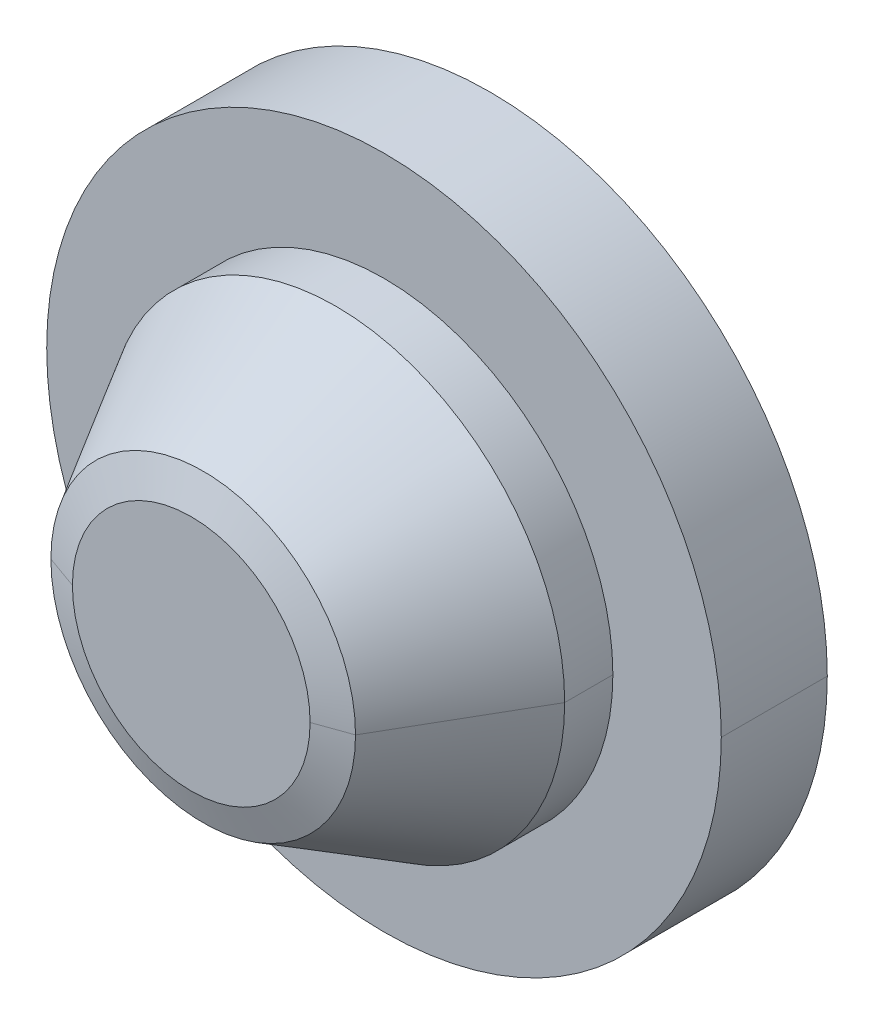
ISO-10303-21;
HEADER;
FILE_DESCRIPTION(('STEP AP214'),'2;1');
FILE_NAME('part.step','',(''),(''),'','','');
FILE_SCHEMA(('AUTOMOTIVE_DESIGN { 1 0 10303 214 1 1 1 1 }'));
ENDSEC;
DATA;
#1=APPLICATION_CONTEXT('core data for automotive mechanical design processes');
#2=APPLICATION_PROTOCOL_DEFINITION('international standard','automotive_design',2000,#1);
#3=PRODUCT_CONTEXT('',#1,'mechanical');
#4=PRODUCT('Part','Part','',(#3));
#5=PRODUCT_RELATED_PRODUCT_CATEGORY('part','',(#4));
#6=PRODUCT_DEFINITION_FORMATION('','',#4);
#7=PRODUCT_DEFINITION_CONTEXT('part definition',#1,'design');
#8=PRODUCT_DEFINITION('design','',#6,#7);
#9=PRODUCT_DEFINITION_SHAPE('','',#8);
#10=(LENGTH_UNIT() NAMED_UNIT(*) SI_UNIT(.MILLI.,.METRE.));
#11=(NAMED_UNIT(*) PLANE_ANGLE_UNIT() SI_UNIT($,.RADIAN.));
#12=(NAMED_UNIT(*) SI_UNIT($,.STERADIAN.) SOLID_ANGLE_UNIT());
#13=UNCERTAINTY_MEASURE_WITH_UNIT(LENGTH_MEASURE(1.E-05),#10,'distance_accuracy_value','');
#14=(GEOMETRIC_REPRESENTATION_CONTEXT(3) GLOBAL_UNCERTAINTY_ASSIGNED_CONTEXT((#13)) GLOBAL_UNIT_ASSIGNED_CONTEXT((#10,
#11,#12)) REPRESENTATION_CONTEXT('',''));
#15=CARTESIAN_POINT('',(0.,0.,0.));
#16=DIRECTION('',(0.,0.,1.));
#17=DIRECTION('',(1.,0.,0.));
#18=AXIS2_PLACEMENT_3D('',#15,#16,#17);
#19=CARTESIAN_POINT('',(149.998561493102,150.001438506898,-74.85));
#20=DIRECTION('',(0.,0.,1.));
#21=DIRECTION('',(1.,0.,0.));
#22=AXIS2_PLACEMENT_3D('',#19,#20,#21);
#23=PLANE('',#22);
#24=CARTESIAN_POINT('',(149.998561493102,150.001438506898,-74.85));
#25=DIRECTION('',(0.,0.,1.));
#26=DIRECTION('',(-1.,0.,0.));
#27=AXIS2_PLACEMENT_3D('',#24,#25,#26);
#28=CIRCLE('',#27,24.66356025634);
#29=CARTESIAN_POINT('',(125.335001236762,150.001438506898,-74.85));
#30=VERTEX_POINT('',#29);
#31=CARTESIAN_POINT('',(174.662121749443,150.001438506898,-74.85));
#32=VERTEX_POINT('',#31);
#33=EDGE_CURVE('E11',#30,#32,#28,.T.);
#34=ORIENTED_EDGE('',*,*,#33,.T.);
#35=CARTESIAN_POINT('',(149.998561493102,150.001438506898,-74.85));
#36=DIRECTION('',(0.,0.,-1.));
#37=DIRECTION('',(-1.,0.,0.));
#38=AXIS2_PLACEMENT_3D('',#35,#36,#37);
#39=CIRCLE('',#38,24.66356025634);
#40=EDGE_CURVE('E28',#30,#32,#39,.T.);
#41=ORIENTED_EDGE('',*,*,#40,.F.);
#42=EDGE_LOOP('',(#34,#41));
#43=FACE_BOUND('',#42,.T.);
#44=ADVANCED_FACE('F17',(#43),#23,.T.);
#45=CARTESIAN_POINT('',(149.998561493102,150.001438506898,-76.09));
#46=DIRECTION('',(0.,0.,-1.));
#47=DIRECTION('',(-1.,0.,0.));
#48=AXIS2_PLACEMENT_3D('',#45,#46,#47);
#49=CONICAL_SURFACE('',#48,28.13744042412,1.22794382715052);
#50=ORIENTED_EDGE('',*,*,#40,.T.);
#51=DIRECTION('',(0.941799559527832,0.,-0.336174939091512));
#52=VECTOR('',#51,1.);
#53=CARTESIAN_POINT('',(174.662121749443,150.001438506898,-74.85));
#54=LINE('',#53,#52);
#55=CARTESIAN_POINT('',(181.609882085003,150.001438506898,-77.33));
#56=VERTEX_POINT('',#55);
#57=EDGE_CURVE('E75',#32,#56,#54,.T.);
#58=ORIENTED_EDGE('',*,*,#57,.T.);
#59=CARTESIAN_POINT('',(149.998561493102,150.001438506898,-77.33));
#60=DIRECTION('',(0.,0.,-1.));
#61=DIRECTION('',(-1.,0.,0.));
#62=AXIS2_PLACEMENT_3D('',#59,#60,#61);
#63=CIRCLE('',#62,31.6113205919);
#64=CARTESIAN_POINT('',(118.387240901202,150.001438506898,-77.33));
#65=VERTEX_POINT('',#64);
#66=EDGE_CURVE('E68',#65,#56,#63,.T.);
#67=ORIENTED_EDGE('',*,*,#66,.F.);
#68=DIRECTION('',(-0.941799559527832,0.,-0.336174939091512));
#69=VECTOR('',#68,1.);
#70=CARTESIAN_POINT('',(125.335001236762,150.001438506898,-74.85));
#71=LINE('',#70,#69);
#72=EDGE_CURVE('E73',#30,#65,#71,.T.);
#73=ORIENTED_EDGE('',*,*,#72,.F.);
#74=EDGE_LOOP('',(#50,#58,#67,#73));
#75=FACE_BOUND('',#74,.T.);
#76=ADVANCED_FACE('F72',(#75),#49,.T.);
#77=CARTESIAN_POINT('',(149.998561493102,150.001438506898,-76.09));
#78=DIRECTION('',(0.,0.,-1.));
#79=DIRECTION('',(-1.,0.,0.));
#80=AXIS2_PLACEMENT_3D('',#77,#78,#79);
#81=CONICAL_SURFACE('',#80,28.13744042412,1.22794382715052);
#82=CARTESIAN_POINT('',(149.998561493102,150.001438506898,-77.33));
#83=DIRECTION('',(0.,0.,1.));
#84=DIRECTION('',(-1.,0.,0.));
#85=AXIS2_PLACEMENT_3D('',#82,#83,#84);
#86=CIRCLE('',#85,31.6113205919);
#87=EDGE_CURVE('E85',#65,#56,#86,.T.);
#88=ORIENTED_EDGE('',*,*,#87,.T.);
#89=ORIENTED_EDGE('',*,*,#57,.F.);
#90=ORIENTED_EDGE('',*,*,#33,.F.);
#91=ORIENTED_EDGE('',*,*,#72,.T.);
#92=EDGE_LOOP('',(#88,#89,#90,#91));
#93=FACE_BOUND('',#92,.T.);
#94=ADVANCED_FACE('F84',(#93),#81,.T.);
#95=CARTESIAN_POINT('',(149.998561493102,150.001438506898,-91.09));
#96=DIRECTION('',(0.,0.,-1.));
#97=DIRECTION('',(-1.,0.,0.));
#98=AXIS2_PLACEMENT_3D('',#95,#96,#97);
#99=CONICAL_SURFACE('',#98,39.55566029595,0.5235987755982);
#100=CARTESIAN_POINT('',(149.998561493102,150.001438506898,-104.85));
#101=DIRECTION('',(0.,0.,1.));
#102=DIRECTION('',(-1.,0.,0.));
#103=AXIS2_PLACEMENT_3D('',#100,#101,#102);
#104=CIRCLE('',#103,47.5);
#105=CARTESIAN_POINT('',(102.498561493102,150.001438506898,-104.85));
#106=VERTEX_POINT('',#105);
#107=CARTESIAN_POINT('',(197.498561493102,150.001438506898,-104.85));
#108=VERTEX_POINT('',#107);
#109=EDGE_CURVE('E87',#106,#108,#104,.T.);
#110=ORIENTED_EDGE('',*,*,#109,.T.);
#111=DIRECTION('',(0.500000000000017,0.,-0.866025403784429));
#112=VECTOR('',#111,1.);
#113=CARTESIAN_POINT('',(181.609882085003,150.001438506898,-77.33));
#114=LINE('',#113,#112);
#115=EDGE_CURVE('E79',#56,#108,#114,.T.);
#116=ORIENTED_EDGE('',*,*,#115,.F.);
#117=ORIENTED_EDGE('',*,*,#87,.F.);
#118=DIRECTION('',(-0.500000000000017,0.,-0.866025403784429));
#119=VECTOR('',#118,1.);
#120=CARTESIAN_POINT('',(118.387240901202,150.001438506898,-77.33));
#121=LINE('',#120,#119);
#122=EDGE_CURVE('E78',#65,#106,#121,.T.);
#123=ORIENTED_EDGE('',*,*,#122,.T.);
#124=EDGE_LOOP('',(#110,#116,#117,#123));
#125=FACE_BOUND('',#124,.T.);
#126=ADVANCED_FACE('F92',(#125),#99,.T.);
#127=CARTESIAN_POINT('',(149.998561493102,150.001438506898,-91.09));
#128=DIRECTION('',(0.,0.,-1.));
#129=DIRECTION('',(-1.,0.,0.));
#130=AXIS2_PLACEMENT_3D('',#127,#128,#129);
#131=CONICAL_SURFACE('',#130,39.55566029595,0.5235987755982);
#132=ORIENTED_EDGE('',*,*,#66,.T.);
#133=ORIENTED_EDGE('',*,*,#115,.T.);
#134=CARTESIAN_POINT('',(149.998561493102,150.001438506898,-104.85));
#135=DIRECTION('',(0.,0.,-1.));
#136=DIRECTION('',(-1.,0.,0.));
#137=AXIS2_PLACEMENT_3D('',#134,#135,#136);
#138=CIRCLE('',#137,47.5);
#139=EDGE_CURVE('E97',#106,#108,#138,.T.);
#140=ORIENTED_EDGE('',*,*,#139,.F.);
#141=ORIENTED_EDGE('',*,*,#122,.F.);
#142=EDGE_LOOP('',(#132,#133,#140,#141));
#143=FACE_BOUND('',#142,.T.);
#144=ADVANCED_FACE('F96',(#143),#131,.T.);
#145=CARTESIAN_POINT('',(149.998561493102,150.001438506898,-139.95));
#146=DIRECTION('',(0.,0.,1.));
#147=DIRECTION('',(1.,0.,0.));
#148=AXIS2_PLACEMENT_3D('',#145,#146,#147);
#149=CYLINDRICAL_SURFACE('',#148,47.5);
#150=ORIENTED_EDGE('',*,*,#139,.T.);
#151=DIRECTION('',(0.,0.,-1.));
#152=VECTOR('',#151,1.);
#153=CARTESIAN_POINT('',(197.498561493102,150.001438506898,-104.85));
#154=LINE('',#153,#152);
#155=CARTESIAN_POINT('',(197.498561493102,150.001438506898,-114.85));
#156=VERTEX_POINT('',#155);
#157=EDGE_CURVE('E114',#108,#156,#154,.T.);
#158=ORIENTED_EDGE('',*,*,#157,.T.);
#159=CARTESIAN_POINT('',(149.998561493102,150.001438506898,-114.85));
#160=DIRECTION('',(0.,0.,-1.));
#161=DIRECTION('',(-1.,0.,0.));
#162=AXIS2_PLACEMENT_3D('',#159,#160,#161);
#163=CIRCLE('',#162,47.5);
#164=CARTESIAN_POINT('',(102.498561493102,150.001438506898,-114.85));
#165=VERTEX_POINT('',#164);
#166=EDGE_CURVE('E121',#165,#156,#163,.T.);
#167=ORIENTED_EDGE('',*,*,#166,.F.);
#168=DIRECTION('',(0.,0.,-1.));
#169=VECTOR('',#168,1.);
#170=CARTESIAN_POINT('',(102.498561493102,150.001438506898,-104.85));
#171=LINE('',#170,#169);
#172=EDGE_CURVE('E21',#106,#165,#171,.T.);
#173=ORIENTED_EDGE('',*,*,#172,.F.);
#174=EDGE_LOOP('',(#150,#158,#167,#173));
#175=FACE_BOUND('',#174,.T.);
#176=ADVANCED_FACE('F165',(#175),#149,.T.);
#177=CARTESIAN_POINT('',(149.998561493102,150.001438506898,-139.95));
#178=DIRECTION('',(0.,0.,1.));
#179=DIRECTION('',(1.,0.,0.));
#180=AXIS2_PLACEMENT_3D('',#177,#178,#179);
#181=CYLINDRICAL_SURFACE('',#180,47.5);
#182=CARTESIAN_POINT('',(149.998561493102,150.001438506898,-114.85));
#183=DIRECTION('',(0.,0.,1.));
#184=DIRECTION('',(-1.,0.,0.));
#185=AXIS2_PLACEMENT_3D('',#182,#183,#184);
#186=CIRCLE('',#185,47.5);
#187=EDGE_CURVE('E141',#165,#156,#186,.T.);
#188=ORIENTED_EDGE('',*,*,#187,.T.);
#189=ORIENTED_EDGE('',*,*,#157,.F.);
#190=ORIENTED_EDGE('',*,*,#109,.F.);
#191=ORIENTED_EDGE('',*,*,#172,.T.);
#192=EDGE_LOOP('',(#188,#189,#190,#191));
#193=FACE_BOUND('',#192,.T.);
#194=ADVANCED_FACE('F152',(#193),#181,.T.);
#195=CARTESIAN_POINT('',(149.998561493102,150.001438506898,-114.85));
#196=DIRECTION('',(0.,0.,1.));
#197=DIRECTION('',(1.,0.,0.));
#198=AXIS2_PLACEMENT_3D('',#195,#196,#197);
#199=PLANE('',#198);
#200=CARTESIAN_POINT('',(149.998561493102,150.001438506898,-114.85));
#201=DIRECTION('',(0.,0.,1.));
#202=DIRECTION('',(-1.,0.,0.));
#203=AXIS2_PLACEMENT_3D('',#200,#201,#202);
#204=CIRCLE('',#203,70.);
#205=CARTESIAN_POINT('',(79.9985614931023,150.001438506898,-114.85));
#206=VERTEX_POINT('',#205);
#207=CARTESIAN_POINT('',(219.998561493102,150.001438506898,-114.85));
#208=VERTEX_POINT('',#207);
#209=EDGE_CURVE('E124',#206,#208,#204,.T.);
#210=ORIENTED_EDGE('',*,*,#209,.T.);
#211=CARTESIAN_POINT('',(149.998561493102,150.001438506898,-114.85));
#212=DIRECTION('',(0.,0.,-1.));
#213=DIRECTION('',(-1.,0.,0.));
#214=AXIS2_PLACEMENT_3D('',#211,#212,#213);
#215=CIRCLE('',#214,70.);
#216=EDGE_CURVE('E109',#206,#208,#215,.T.);
#217=ORIENTED_EDGE('',*,*,#216,.F.);
#218=EDGE_LOOP('',(#210,#217));
#219=FACE_BOUND('',#218,.T.);
#220=ORIENTED_EDGE('',*,*,#166,.T.);
#221=ORIENTED_EDGE('',*,*,#187,.F.);
#222=EDGE_LOOP('',(#220,#221));
#223=FACE_BOUND('',#222,.T.);
#224=ADVANCED_FACE('F154',(#219,#223),#199,.T.);
#225=CARTESIAN_POINT('',(149.998561493102,150.001438506898,-139.95));
#226=DIRECTION('',(0.,0.,1.));
#227=DIRECTION('',(1.,0.,0.));
#228=AXIS2_PLACEMENT_3D('',#225,#226,#227);
#229=CYLINDRICAL_SURFACE('',#228,70.);
#230=ORIENTED_EDGE('',*,*,#216,.T.);
#231=DIRECTION('',(0.,0.,-1.));
#232=VECTOR('',#231,1.);
#233=CARTESIAN_POINT('',(219.998561493102,150.001438506898,-114.85));
#234=LINE('',#233,#232);
#235=CARTESIAN_POINT('',(219.998561493102,150.001438506898,-136.85));
#236=VERTEX_POINT('',#235);
#237=EDGE_CURVE('E105',#208,#236,#234,.T.);
#238=ORIENTED_EDGE('',*,*,#237,.T.);
#239=CARTESIAN_POINT('',(149.998561493102,150.001438506898,-136.85));
#240=DIRECTION('',(0.,0.,-1.));
#241=DIRECTION('',(-1.,0.,0.));
#242=AXIS2_PLACEMENT_3D('',#239,#240,#241);
#243=CIRCLE('',#242,70.);
#244=CARTESIAN_POINT('',(79.9985614931023,150.001438506898,-136.85));
#245=VERTEX_POINT('',#244);
#246=EDGE_CURVE('E204',#245,#236,#243,.T.);
#247=ORIENTED_EDGE('',*,*,#246,.F.);
#248=DIRECTION('',(0.,0.,-1.));
#249=VECTOR('',#248,1.);
#250=CARTESIAN_POINT('',(79.9985614931023,150.001438506898,-114.85));
#251=LINE('',#250,#249);
#252=EDGE_CURVE('E120',#206,#245,#251,.T.);
#253=ORIENTED_EDGE('',*,*,#252,.F.);
#254=EDGE_LOOP('',(#230,#238,#247,#253));
#255=FACE_BOUND('',#254,.T.);
#256=ADVANCED_FACE('F156',(#255),#229,.T.);
#257=CARTESIAN_POINT('',(149.998561493102,150.001438506898,-139.95));
#258=DIRECTION('',(0.,0.,1.));
#259=DIRECTION('',(1.,0.,0.));
#260=AXIS2_PLACEMENT_3D('',#257,#258,#259);
#261=CYLINDRICAL_SURFACE('',#260,70.);
#262=CARTESIAN_POINT('',(149.998561493102,150.001438506898,-136.85));
#263=DIRECTION('',(0.,0.,1.));
#264=DIRECTION('',(-1.,0.,0.));
#265=AXIS2_PLACEMENT_3D('',#262,#263,#264);
#266=CIRCLE('',#265,70.);
#267=EDGE_CURVE('E110',#245,#236,#266,.T.);
#268=ORIENTED_EDGE('',*,*,#267,.T.);
#269=ORIENTED_EDGE('',*,*,#237,.F.);
#270=ORIENTED_EDGE('',*,*,#209,.F.);
#271=ORIENTED_EDGE('',*,*,#252,.T.);
#272=EDGE_LOOP('',(#268,#269,#270,#271));
#273=FACE_BOUND('',#272,.T.);
#274=ADVANCED_FACE('F19',(#273),#261,.T.);
#275=CARTESIAN_POINT('',(149.998561493102,150.001438506898,-136.85));
#276=DIRECTION('',(0.,0.,1.));
#277=DIRECTION('',(1.,0.,0.));
#278=AXIS2_PLACEMENT_3D('',#275,#276,#277);
#279=PLANE('',#278);
#280=ORIENTED_EDGE('',*,*,#267,.F.);
#281=ORIENTED_EDGE('',*,*,#246,.T.);
#282=EDGE_LOOP('',(#280,#281));
#283=FACE_BOUND('',#282,.T.);
#284=ADVANCED_FACE('F214',(#283),#279,.F.);
#285=CLOSED_SHELL('',(#44,#76,#94,#126,#144,#176,#194,#224,#256,#274,#284));
#286=MANIFOLD_SOLID_BREP('B1',#285);
#287=ADVANCED_BREP_SHAPE_REPRESENTATION('',(#18,#286),#14);
#288=SHAPE_DEFINITION_REPRESENTATION(#9,#287);
ENDSEC;
END-ISO-10303-21;
